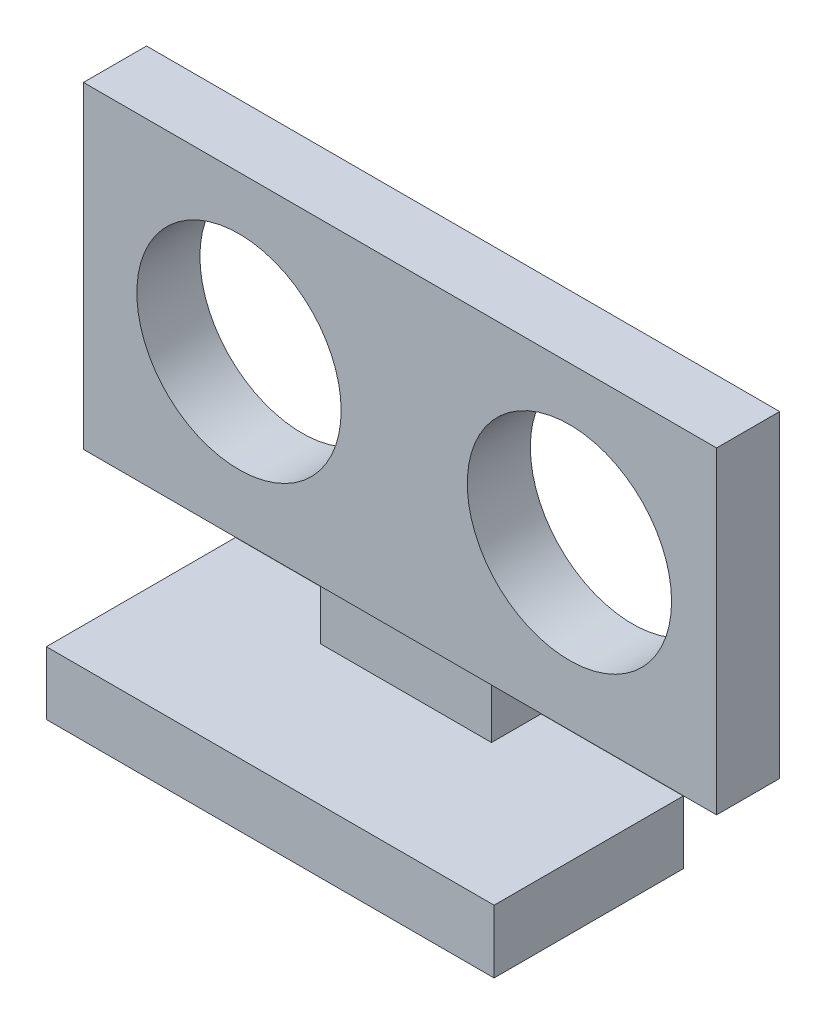
ISO-10303-21;
HEADER;
FILE_DESCRIPTION(('STEP AP214'),'2;1');
FILE_NAME('part.step','',(''),(''),'','','');
FILE_SCHEMA(('AUTOMOTIVE_DESIGN { 1 0 10303 214 1 1 1 1 }'));
ENDSEC;
DATA;
#1=APPLICATION_CONTEXT('core data for automotive mechanical design processes');
#2=APPLICATION_PROTOCOL_DEFINITION('international standard','automotive_design',2000,#1);
#3=PRODUCT_CONTEXT('',#1,'mechanical');
#4=PRODUCT('Part','Part','',(#3));
#5=PRODUCT_RELATED_PRODUCT_CATEGORY('part','',(#4));
#6=PRODUCT_DEFINITION_FORMATION('','',#4);
#7=PRODUCT_DEFINITION_CONTEXT('part definition',#1,'design');
#8=PRODUCT_DEFINITION('design','',#6,#7);
#9=PRODUCT_DEFINITION_SHAPE('','',#8);
#10=(LENGTH_UNIT() NAMED_UNIT(*) SI_UNIT(.MILLI.,.METRE.));
#11=(NAMED_UNIT(*) PLANE_ANGLE_UNIT() SI_UNIT($,.RADIAN.));
#12=(NAMED_UNIT(*) SI_UNIT($,.STERADIAN.) SOLID_ANGLE_UNIT());
#13=UNCERTAINTY_MEASURE_WITH_UNIT(LENGTH_MEASURE(1.E-05),#10,'distance_accuracy_value','');
#14=(GEOMETRIC_REPRESENTATION_CONTEXT(3) GLOBAL_UNCERTAINTY_ASSIGNED_CONTEXT((#13)) GLOBAL_UNIT_ASSIGNED_CONTEXT((#10,
#11,#12)) REPRESENTATION_CONTEXT('',''));
#15=CARTESIAN_POINT('',(0.,0.,0.));
#16=DIRECTION('',(0.,0.,1.));
#17=DIRECTION('',(1.,0.,0.));
#18=AXIS2_PLACEMENT_3D('',#15,#16,#17);
#19=CARTESIAN_POINT('',(14.504129859339,5.,0.));
#20=DIRECTION('',(1.,0.,0.));
#21=DIRECTION('',(0.,0.,-1.));
#22=AXIS2_PLACEMENT_3D('',#19,#20,#21);
#23=PLANE('',#22);
#24=DIRECTION('',(0.,0.,1.));
#25=VECTOR('',#24,1.);
#26=CARTESIAN_POINT('',(14.504129859339,0.,0.));
#27=LINE('',#26,#25);
#28=CARTESIAN_POINT('',(14.504129859339,0.,-21.2753882568971));
#29=VERTEX_POINT('',#28);
#30=CARTESIAN_POINT('',(14.504129859339,0.,-6.27538825689709));
#31=VERTEX_POINT('',#30);
#32=EDGE_CURVE('E231',#29,#31,#27,.T.);
#33=ORIENTED_EDGE('',*,*,#32,.T.);
#34=DIRECTION('',(0.,-1.,0.));
#35=VECTOR('',#34,1.);
#36=CARTESIAN_POINT('',(14.504129859339,5.,-6.27538825689709));
#37=LINE('',#36,#35);
#38=CARTESIAN_POINT('',(14.504129859339,5.,-6.27538825689709));
#39=VERTEX_POINT('',#38);
#40=EDGE_CURVE('E11',#39,#31,#37,.T.);
#41=ORIENTED_EDGE('',*,*,#40,.F.);
#42=DIRECTION('',(0.,0.,1.));
#43=VECTOR('',#42,1.);
#44=CARTESIAN_POINT('',(14.504129859339,5.,0.));
#45=LINE('',#44,#43);
#46=CARTESIAN_POINT('',(14.504129859339,5.,-21.2753882568971));
#47=VERTEX_POINT('',#46);
#48=EDGE_CURVE('E232',#47,#39,#45,.T.);
#49=ORIENTED_EDGE('',*,*,#48,.F.);
#50=DIRECTION('',(0.,-1.,0.));
#51=VECTOR('',#50,1.);
#52=CARTESIAN_POINT('',(14.504129859339,5.,-21.2753882568971));
#53=LINE('',#52,#51);
#54=EDGE_CURVE('E248',#47,#29,#53,.T.);
#55=ORIENTED_EDGE('',*,*,#54,.T.);
#56=EDGE_LOOP('',(#33,#41,#49,#55));
#57=FACE_BOUND('',#56,.T.);
#58=ADVANCED_FACE('F46',(#57),#23,.F.);
#59=CARTESIAN_POINT('',(0.,5.,-6.27538825689709));
#60=DIRECTION('',(0.,0.,-1.));
#61=DIRECTION('',(-1.,0.,0.));
#62=AXIS2_PLACEMENT_3D('',#59,#60,#61);
#63=PLANE('',#62);
#64=DIRECTION('',(1.,0.,0.));
#65=VECTOR('',#64,1.);
#66=CARTESIAN_POINT('',(0.,0.,-6.27538825689709));
#67=LINE('',#66,#65);
#68=CARTESIAN_POINT('',(50.004129859339,0.,-6.27538825689709));
#69=VERTEX_POINT('',#68);
#70=EDGE_CURVE('E252',#31,#69,#67,.T.);
#71=ORIENTED_EDGE('',*,*,#70,.T.);
#72=DIRECTION('',(0.,-1.,0.));
#73=VECTOR('',#72,1.);
#74=CARTESIAN_POINT('',(50.004129859339,5.,-6.27538825689709));
#75=LINE('',#74,#73);
#76=CARTESIAN_POINT('',(50.004129859339,5.,-6.27538825689709));
#77=VERTEX_POINT('',#76);
#78=EDGE_CURVE('E55',#77,#69,#75,.T.);
#79=ORIENTED_EDGE('',*,*,#78,.F.);
#80=DIRECTION('',(1.,0.,0.));
#81=VECTOR('',#80,1.);
#82=CARTESIAN_POINT('',(0.,5.,-6.27538825689709));
#83=LINE('',#82,#81);
#84=EDGE_CURVE('E236',#39,#77,#83,.T.);
#85=ORIENTED_EDGE('',*,*,#84,.F.);
#86=ORIENTED_EDGE('',*,*,#40,.T.);
#87=EDGE_LOOP('',(#71,#79,#85,#86));
#88=FACE_BOUND('',#87,.T.);
#89=ADVANCED_FACE('F305',(#88),#63,.F.);
#90=CARTESIAN_POINT('',(50.004129859339,5.,0.));
#91=DIRECTION('',(1.,0.,0.));
#92=DIRECTION('',(0.,0.,-1.));
#93=AXIS2_PLACEMENT_3D('',#90,#91,#92);
#94=PLANE('',#93);
#95=DIRECTION('',(0.,0.,1.));
#96=VECTOR('',#95,1.);
#97=CARTESIAN_POINT('',(50.004129859339,0.,0.));
#98=LINE('',#97,#96);
#99=CARTESIAN_POINT('',(50.004129859339,0.,-21.2753882568971));
#100=VERTEX_POINT('',#99);
#101=EDGE_CURVE('E256',#100,#69,#98,.T.);
#102=ORIENTED_EDGE('',*,*,#101,.F.);
#103=DIRECTION('',(0.,-1.,0.));
#104=VECTOR('',#103,1.);
#105=CARTESIAN_POINT('',(50.004129859339,5.,-21.2753882568971));
#106=LINE('',#105,#104);
#107=CARTESIAN_POINT('',(50.004129859339,5.,-21.2753882568971));
#108=VERTEX_POINT('',#107);
#109=EDGE_CURVE('E265',#108,#100,#106,.T.);
#110=ORIENTED_EDGE('',*,*,#109,.F.);
#111=DIRECTION('',(0.,0.,1.));
#112=VECTOR('',#111,1.);
#113=CARTESIAN_POINT('',(50.004129859339,5.,0.));
#114=LINE('',#113,#112);
#115=EDGE_CURVE('E240',#108,#77,#114,.T.);
#116=ORIENTED_EDGE('',*,*,#115,.T.);
#117=ORIENTED_EDGE('',*,*,#78,.T.);
#118=EDGE_LOOP('',(#102,#110,#116,#117));
#119=FACE_BOUND('',#118,.T.);
#120=ADVANCED_FACE('F310',(#119),#94,.T.);
#121=CARTESIAN_POINT('',(0.,5.,-21.2753882568971));
#122=DIRECTION('',(0.,0.,-1.));
#123=DIRECTION('',(-1.,0.,0.));
#124=AXIS2_PLACEMENT_3D('',#121,#122,#123);
#125=PLANE('',#124);
#126=DIRECTION('',(1.,0.,0.));
#127=VECTOR('',#126,1.);
#128=CARTESIAN_POINT('',(0.,0.,-21.2753882568971));
#129=LINE('',#128,#127);
#130=EDGE_CURVE('E237',#29,#100,#129,.T.);
#131=ORIENTED_EDGE('',*,*,#130,.F.);
#132=ORIENTED_EDGE('',*,*,#54,.F.);
#133=DIRECTION('',(1.,0.,0.));
#134=VECTOR('',#133,1.);
#135=CARTESIAN_POINT('',(0.,5.,-21.2753882568971));
#136=LINE('',#135,#134);
#137=CARTESIAN_POINT('',(25.1664974837204,5.,-21.2753882568971));
#138=VERTEX_POINT('',#137);
#139=EDGE_CURVE('E244',#47,#138,#136,.T.);
#140=ORIENTED_EDGE('',*,*,#139,.T.);
#141=DIRECTION('',(0.,-1.,0.));
#142=VECTOR('',#141,1.);
#143=CARTESIAN_POINT('',(25.1664974837204,10.,-21.2753882568971));
#144=LINE('',#143,#142);
#145=CARTESIAN_POINT('',(25.1664974837204,10.,-21.2753882568971));
#146=VERTEX_POINT('',#145);
#147=EDGE_CURVE('E209',#146,#138,#144,.T.);
#148=ORIENTED_EDGE('',*,*,#147,.F.);
#149=DIRECTION('',(-1.,0.,0.));
#150=VECTOR('',#149,1.);
#151=CARTESIAN_POINT('',(25.1664974837204,10.,-21.2753882568971));
#152=LINE('',#151,#150);
#153=CARTESIAN_POINT('',(38.7335825591619,10.,-21.2753882568971));
#154=VERTEX_POINT('',#153);
#155=EDGE_CURVE('E205',#154,#146,#152,.T.);
#156=ORIENTED_EDGE('',*,*,#155,.F.);
#157=DIRECTION('',(0.,-1.,0.));
#158=VECTOR('',#157,1.);
#159=CARTESIAN_POINT('',(38.7335825591619,10.,-21.2753882568971));
#160=LINE('',#159,#158);
#161=CARTESIAN_POINT('',(38.7335825591619,5.,-21.2753882568971));
#162=VERTEX_POINT('',#161);
#163=EDGE_CURVE('E220',#154,#162,#160,.T.);
#164=ORIENTED_EDGE('',*,*,#163,.T.);
#165=EDGE_CURVE('E69',#162,#108,#136,.T.);
#166=ORIENTED_EDGE('',*,*,#165,.T.);
#167=ORIENTED_EDGE('',*,*,#109,.T.);
#168=EDGE_LOOP('',(#131,#132,#140,#148,#156,#164,#166,#167));
#169=FACE_BOUND('',#168,.T.);
#170=ADVANCED_FACE('F319',(#169),#125,.T.);
#171=CARTESIAN_POINT('',(0.,5.,0.));
#172=DIRECTION('',(0.,1.,0.));
#173=DIRECTION('',(0.,0.,1.));
#174=AXIS2_PLACEMENT_3D('',#171,#172,#173);
#175=PLANE('',#174);
#176=DIRECTION('',(0.,0.,1.));
#177=VECTOR('',#176,1.);
#178=CARTESIAN_POINT('',(25.1664974837204,5.,-21.2753882568971));
#179=LINE('',#178,#177);
#180=CARTESIAN_POINT('',(25.1664974837204,5.,-17.3425959706985));
#181=VERTEX_POINT('',#180);
#182=EDGE_CURVE('E160',#138,#181,#179,.T.);
#183=ORIENTED_EDGE('',*,*,#182,.F.);
#184=ORIENTED_EDGE('',*,*,#139,.F.);
#185=ORIENTED_EDGE('',*,*,#48,.T.);
#186=ORIENTED_EDGE('',*,*,#84,.T.);
#187=ORIENTED_EDGE('',*,*,#115,.F.);
#188=ORIENTED_EDGE('',*,*,#165,.F.);
#189=DIRECTION('',(0.,0.,-1.));
#190=VECTOR('',#189,1.);
#191=CARTESIAN_POINT('',(38.7335825591619,5.,-21.2753882568971));
#192=LINE('',#191,#190);
#193=CARTESIAN_POINT('',(38.7335825591619,5.,-17.3425959706985));
#194=VERTEX_POINT('',#193);
#195=EDGE_CURVE('E197',#194,#162,#192,.T.);
#196=ORIENTED_EDGE('',*,*,#195,.F.);
#197=DIRECTION('',(1.,0.,0.));
#198=VECTOR('',#197,1.);
#199=CARTESIAN_POINT('',(25.1664974837204,5.,-17.3425959706985));
#200=LINE('',#199,#198);
#201=EDGE_CURVE('E63',#181,#194,#200,.T.);
#202=ORIENTED_EDGE('',*,*,#201,.F.);
#203=EDGE_LOOP('',(#183,#184,#185,#186,#187,#188,#196,#202));
#204=FACE_BOUND('',#203,.T.);
#205=ADVANCED_FACE('F325',(#204),#175,.T.);
#206=CARTESIAN_POINT('',(0.,0.,0.));
#207=DIRECTION('',(0.,1.,0.));
#208=DIRECTION('',(0.,0.,1.));
#209=AXIS2_PLACEMENT_3D('',#206,#207,#208);
#210=PLANE('',#209);
#211=ORIENTED_EDGE('',*,*,#32,.F.);
#212=ORIENTED_EDGE('',*,*,#130,.T.);
#213=ORIENTED_EDGE('',*,*,#101,.T.);
#214=ORIENTED_EDGE('',*,*,#70,.F.);
#215=EDGE_LOOP('',(#211,#212,#213,#214));
#216=FACE_BOUND('',#215,.T.);
#217=ADVANCED_FACE('F317',(#216),#210,.F.);
#218=CARTESIAN_POINT('',(25.1664974837204,10.,-21.2753882568971));
#219=DIRECTION('',(1.,0.,0.));
#220=DIRECTION('',(0.,0.,-1.));
#221=AXIS2_PLACEMENT_3D('',#218,#219,#220);
#222=PLANE('',#221);
#223=ORIENTED_EDGE('',*,*,#182,.T.);
#224=DIRECTION('',(0.,-1.,0.));
#225=VECTOR('',#224,1.);
#226=CARTESIAN_POINT('',(25.1664974837204,10.,-17.3425959706985));
#227=LINE('',#226,#225);
#228=CARTESIAN_POINT('',(25.1664974837204,10.,-17.3425959706985));
#229=VERTEX_POINT('',#228);
#230=EDGE_CURVE('E228',#229,#181,#227,.T.);
#231=ORIENTED_EDGE('',*,*,#230,.F.);
#232=DIRECTION('',(0.,0.,1.));
#233=VECTOR('',#232,1.);
#234=CARTESIAN_POINT('',(25.1664974837204,10.,-21.2753882568971));
#235=LINE('',#234,#233);
#236=EDGE_CURVE('E192',#146,#229,#235,.T.);
#237=ORIENTED_EDGE('',*,*,#236,.F.);
#238=ORIENTED_EDGE('',*,*,#147,.T.);
#239=EDGE_LOOP('',(#223,#231,#237,#238));
#240=FACE_BOUND('',#239,.T.);
#241=ADVANCED_FACE('F329',(#240),#222,.F.);
#242=CARTESIAN_POINT('',(25.1664974837204,10.,-17.3425959706985));
#243=DIRECTION('',(0.,0.,-1.));
#244=DIRECTION('',(-1.,0.,0.));
#245=AXIS2_PLACEMENT_3D('',#242,#243,#244);
#246=PLANE('',#245);
#247=ORIENTED_EDGE('',*,*,#201,.T.);
#248=DIRECTION('',(0.,-1.,0.));
#249=VECTOR('',#248,1.);
#250=CARTESIAN_POINT('',(38.7335825591619,10.,-17.3425959706985));
#251=LINE('',#250,#249);
#252=CARTESIAN_POINT('',(38.7335825591619,10.,-17.3425959706985));
#253=VERTEX_POINT('',#252);
#254=EDGE_CURVE('E224',#253,#194,#251,.T.);
#255=ORIENTED_EDGE('',*,*,#254,.F.);
#256=DIRECTION('',(1.,0.,0.));
#257=VECTOR('',#256,1.);
#258=CARTESIAN_POINT('',(25.1664974837204,10.,-17.3425959706985));
#259=LINE('',#258,#257);
#260=EDGE_CURVE('E196',#229,#253,#259,.T.);
#261=ORIENTED_EDGE('',*,*,#260,.F.);
#262=ORIENTED_EDGE('',*,*,#230,.T.);
#263=EDGE_LOOP('',(#247,#255,#261,#262));
#264=FACE_BOUND('',#263,.T.);
#265=ADVANCED_FACE('F301',(#264),#246,.F.);
#266=CARTESIAN_POINT('',(38.7335825591619,10.,-21.2753882568971));
#267=DIRECTION('',(-1.,0.,0.));
#268=DIRECTION('',(0.,0.,1.));
#269=AXIS2_PLACEMENT_3D('',#266,#267,#268);
#270=PLANE('',#269);
#271=ORIENTED_EDGE('',*,*,#195,.T.);
#272=ORIENTED_EDGE('',*,*,#163,.F.);
#273=DIRECTION('',(0.,0.,-1.));
#274=VECTOR('',#273,1.);
#275=CARTESIAN_POINT('',(38.7335825591619,10.,-21.2753882568971));
#276=LINE('',#275,#274);
#277=EDGE_CURVE('E201',#253,#154,#276,.T.);
#278=ORIENTED_EDGE('',*,*,#277,.F.);
#279=ORIENTED_EDGE('',*,*,#254,.T.);
#280=EDGE_LOOP('',(#271,#272,#278,#279));
#281=FACE_BOUND('',#280,.T.);
#282=ADVANCED_FACE('F290',(#281),#270,.F.);
#283=CARTESIAN_POINT('',(7.42685159690627,35.2,-16.2947715854473));
#284=DIRECTION('',(0.,0.,-1.));
#285=DIRECTION('',(-1.,0.,0.));
#286=AXIS2_PLACEMENT_3D('',#283,#284,#285);
#287=PLANE('',#286);
#288=CARTESIAN_POINT('',(19.7589001193031,22.8758763229992,-16.2947715854473));
#289=DIRECTION('',(0.,0.,1.));
#290=DIRECTION('',(1.,0.,0.));
#291=AXIS2_PLACEMENT_3D('',#288,#289,#290);
#292=CIRCLE('',#291,8.09999999999999);
#293=CARTESIAN_POINT('',(27.8589001193031,22.8758763229992,-16.2947715854473));
#294=VERTEX_POINT('',#293);
#295=EDGE_CURVE('E272',#294,#294,#292,.T.);
#296=ORIENTED_EDGE('',*,*,#295,.F.);
#297=EDGE_LOOP('',(#296));
#298=FACE_BOUND('',#297,.T.);
#299=CARTESIAN_POINT('',(45.9589001193031,22.8758763229992,-16.2947715854473));
#300=DIRECTION('',(0.,0.,1.));
#301=DIRECTION('',(1.,0.,0.));
#302=AXIS2_PLACEMENT_3D('',#299,#300,#301);
#303=CIRCLE('',#302,8.1);
#304=CARTESIAN_POINT('',(54.0589001193031,22.8758763229992,-16.2947715854473));
#305=VERTEX_POINT('',#304);
#306=EDGE_CURVE('E279',#305,#305,#303,.T.);
#307=ORIENTED_EDGE('',*,*,#306,.F.);
#308=EDGE_LOOP('',(#307));
#309=FACE_BOUND('',#308,.T.);
#310=DIRECTION('',(1.,0.,0.));
#311=VECTOR('',#310,1.);
#312=CARTESIAN_POINT('',(7.42685159690627,10.,-16.2947715854473));
#313=LINE('',#312,#311);
#314=CARTESIAN_POINT('',(7.42685159690627,10.,-16.2947715854473));
#315=VERTEX_POINT('',#314);
#316=CARTESIAN_POINT('',(57.6268515969063,10.,-16.2947715854473));
#317=VERTEX_POINT('',#316);
#318=EDGE_CURVE('E155',#315,#317,#313,.T.);
#319=ORIENTED_EDGE('',*,*,#318,.T.);
#320=DIRECTION('',(0.,-1.,0.));
#321=VECTOR('',#320,1.);
#322=CARTESIAN_POINT('',(57.6268515969063,35.2,-16.2947715854473));
#323=LINE('',#322,#321);
#324=CARTESIAN_POINT('',(57.6268515969063,35.2,-16.2947715854473));
#325=VERTEX_POINT('',#324);
#326=EDGE_CURVE('E152',#325,#317,#323,.T.);
#327=ORIENTED_EDGE('',*,*,#326,.F.);
#328=DIRECTION('',(1.,0.,0.));
#329=VECTOR('',#328,1.);
#330=CARTESIAN_POINT('',(7.42685159690627,35.2,-16.2947715854473));
#331=LINE('',#330,#329);
#332=CARTESIAN_POINT('',(7.42685159690627,35.2,-16.2947715854473));
#333=VERTEX_POINT('',#332);
#334=EDGE_CURVE('E136',#333,#325,#331,.T.);
#335=ORIENTED_EDGE('',*,*,#334,.F.);
#336=DIRECTION('',(0.,-1.,0.));
#337=VECTOR('',#336,1.);
#338=CARTESIAN_POINT('',(7.42685159690627,35.2,-16.2947715854473));
#339=LINE('',#338,#337);
#340=EDGE_CURVE('E173',#333,#315,#339,.T.);
#341=ORIENTED_EDGE('',*,*,#340,.T.);
#342=EDGE_LOOP('',(#319,#327,#335,#341));
#343=FACE_BOUND('',#342,.T.);
#344=ADVANCED_FACE('F153',(#298,#309,#343),#287,.F.);
#345=CARTESIAN_POINT('',(57.6268515969063,35.2,-21.2947715854473));
#346=DIRECTION('',(1.,0.,0.));
#347=DIRECTION('',(0.,0.,-1.));
#348=AXIS2_PLACEMENT_3D('',#345,#346,#347);
#349=PLANE('',#348);
#350=DIRECTION('',(0.,0.,1.));
#351=VECTOR('',#350,1.);
#352=CARTESIAN_POINT('',(57.6268515969063,10.,-21.2947715854473));
#353=LINE('',#352,#351);
#354=CARTESIAN_POINT('',(57.6268515969063,10.,-21.2947715854473));
#355=VERTEX_POINT('',#354);
#356=EDGE_CURVE('E176',#355,#317,#353,.T.);
#357=ORIENTED_EDGE('',*,*,#356,.F.);
#358=DIRECTION('',(0.,-1.,0.));
#359=VECTOR('',#358,1.);
#360=CARTESIAN_POINT('',(57.6268515969063,35.2,-21.2947715854473));
#361=LINE('',#360,#359);
#362=CARTESIAN_POINT('',(57.6268515969063,35.2,-21.2947715854473));
#363=VERTEX_POINT('',#362);
#364=EDGE_CURVE('E161',#363,#355,#361,.T.);
#365=ORIENTED_EDGE('',*,*,#364,.F.);
#366=DIRECTION('',(0.,0.,1.));
#367=VECTOR('',#366,1.);
#368=CARTESIAN_POINT('',(57.6268515969063,35.2,-21.2947715854473));
#369=LINE('',#368,#367);
#370=EDGE_CURVE('E141',#363,#325,#369,.T.);
#371=ORIENTED_EDGE('',*,*,#370,.T.);
#372=ORIENTED_EDGE('',*,*,#326,.T.);
#373=EDGE_LOOP('',(#357,#365,#371,#372));
#374=FACE_BOUND('',#373,.T.);
#375=ADVANCED_FACE('F163',(#374),#349,.T.);
#376=CARTESIAN_POINT('',(7.42685159690604,35.2,-21.2947715854473));
#377=DIRECTION('',(0.,0.,-1.));
#378=DIRECTION('',(-1.,0.,0.));
#379=AXIS2_PLACEMENT_3D('',#376,#377,#378);
#380=PLANE('',#379);
#381=CARTESIAN_POINT('',(19.7589001193031,22.8758763229992,-21.2947715854473));
#382=DIRECTION('',(0.,0.,-1.));
#383=DIRECTION('',(-1.,0.,0.));
#384=AXIS2_PLACEMENT_3D('',#381,#382,#383);
#385=CIRCLE('',#384,8.09999999999999);
#386=CARTESIAN_POINT('',(11.6589001193031,22.8758763229992,-21.2947715854473));
#387=VERTEX_POINT('',#386);
#388=EDGE_CURVE('E49',#387,#387,#385,.T.);
#389=ORIENTED_EDGE('',*,*,#388,.F.);
#390=EDGE_LOOP('',(#389));
#391=FACE_BOUND('',#390,.T.);
#392=CARTESIAN_POINT('',(45.9589001193031,22.8758763229992,-21.2947715854473));
#393=DIRECTION('',(0.,0.,-1.));
#394=DIRECTION('',(-1.,0.,0.));
#395=AXIS2_PLACEMENT_3D('',#392,#393,#394);
#396=CIRCLE('',#395,8.1);
#397=CARTESIAN_POINT('',(37.8589001193031,22.8758763229992,-21.2947715854473));
#398=VERTEX_POINT('',#397);
#399=EDGE_CURVE('E269',#398,#398,#396,.T.);
#400=ORIENTED_EDGE('',*,*,#399,.F.);
#401=EDGE_LOOP('',(#400));
#402=FACE_BOUND('',#401,.T.);
#403=DIRECTION('',(1.,0.,0.));
#404=VECTOR('',#403,1.);
#405=CARTESIAN_POINT('',(7.42685159690604,10.,-21.2947715854473));
#406=LINE('',#405,#404);
#407=CARTESIAN_POINT('',(7.42685159690604,10.,-21.2947715854473));
#408=VERTEX_POINT('',#407);
#409=EDGE_CURVE('E179',#408,#355,#406,.T.);
#410=ORIENTED_EDGE('',*,*,#409,.F.);
#411=DIRECTION('',(0.,-1.,0.));
#412=VECTOR('',#411,1.);
#413=CARTESIAN_POINT('',(7.42685159690604,35.2,-21.2947715854473));
#414=LINE('',#413,#412);
#415=CARTESIAN_POINT('',(7.42685159690604,35.2,-21.2947715854473));
#416=VERTEX_POINT('',#415);
#417=EDGE_CURVE('E187',#416,#408,#414,.T.);
#418=ORIENTED_EDGE('',*,*,#417,.F.);
#419=DIRECTION('',(1.,0.,0.));
#420=VECTOR('',#419,1.);
#421=CARTESIAN_POINT('',(7.42685159690604,35.2,-21.2947715854473));
#422=LINE('',#421,#420);
#423=EDGE_CURVE('E165',#416,#363,#422,.T.);
#424=ORIENTED_EDGE('',*,*,#423,.T.);
#425=ORIENTED_EDGE('',*,*,#364,.T.);
#426=EDGE_LOOP('',(#410,#418,#424,#425));
#427=FACE_BOUND('',#426,.T.);
#428=ADVANCED_FACE('F298',(#391,#402,#427),#380,.T.);
#429=CARTESIAN_POINT('',(7.42685159690604,35.2,-21.2947715854473));
#430=DIRECTION('',(1.,0.,0.));
#431=DIRECTION('',(0.,0.,-1.));
#432=AXIS2_PLACEMENT_3D('',#429,#430,#431);
#433=PLANE('',#432);
#434=DIRECTION('',(0.,0.,1.));
#435=VECTOR('',#434,1.);
#436=CARTESIAN_POINT('',(7.42685159690604,10.,-21.2947715854473));
#437=LINE('',#436,#435);
#438=EDGE_CURVE('E149',#408,#315,#437,.T.);
#439=ORIENTED_EDGE('',*,*,#438,.T.);
#440=ORIENTED_EDGE('',*,*,#340,.F.);
#441=DIRECTION('',(0.,0.,1.));
#442=VECTOR('',#441,1.);
#443=CARTESIAN_POINT('',(7.42685159690604,35.2,-21.2947715854473));
#444=LINE('',#443,#442);
#445=EDGE_CURVE('E144',#416,#333,#444,.T.);
#446=ORIENTED_EDGE('',*,*,#445,.F.);
#447=ORIENTED_EDGE('',*,*,#417,.T.);
#448=EDGE_LOOP('',(#439,#440,#446,#447));
#449=FACE_BOUND('',#448,.T.);
#450=ADVANCED_FACE('F406',(#449),#433,.F.);
#451=CARTESIAN_POINT('',(0.,35.2,0.));
#452=DIRECTION('',(0.,-1.,0.));
#453=DIRECTION('',(0.,0.,-1.));
#454=AXIS2_PLACEMENT_3D('',#451,#452,#453);
#455=PLANE('',#454);
#456=ORIENTED_EDGE('',*,*,#334,.T.);
#457=ORIENTED_EDGE('',*,*,#370,.F.);
#458=ORIENTED_EDGE('',*,*,#423,.F.);
#459=ORIENTED_EDGE('',*,*,#445,.T.);
#460=EDGE_LOOP('',(#456,#457,#458,#459));
#461=FACE_BOUND('',#460,.T.);
#462=ADVANCED_FACE('F138',(#461),#455,.F.);
#463=CARTESIAN_POINT('',(0.,10.,0.));
#464=DIRECTION('',(0.,-1.,0.));
#465=DIRECTION('',(0.,0.,-1.));
#466=AXIS2_PLACEMENT_3D('',#463,#464,#465);
#467=PLANE('',#466);
#468=ORIENTED_EDGE('',*,*,#155,.T.);
#469=ORIENTED_EDGE('',*,*,#236,.T.);
#470=ORIENTED_EDGE('',*,*,#260,.T.);
#471=ORIENTED_EDGE('',*,*,#277,.T.);
#472=EDGE_LOOP('',(#468,#469,#470,#471));
#473=FACE_BOUND('',#472,.T.);
#474=ORIENTED_EDGE('',*,*,#318,.F.);
#475=ORIENTED_EDGE('',*,*,#438,.F.);
#476=ORIENTED_EDGE('',*,*,#409,.T.);
#477=ORIENTED_EDGE('',*,*,#356,.T.);
#478=EDGE_LOOP('',(#474,#475,#476,#477));
#479=FACE_BOUND('',#478,.T.);
#480=ADVANCED_FACE('F332',(#473,#479),#467,.T.);
#481=CARTESIAN_POINT('',(45.9589001193031,22.8758763229992,-26.2947715854473));
#482=DIRECTION('',(0.,0.,1.));
#483=DIRECTION('',(1.,0.,0.));
#484=AXIS2_PLACEMENT_3D('',#481,#482,#483);
#485=CYLINDRICAL_SURFACE('',#484,8.1);
#486=ORIENTED_EDGE('',*,*,#399,.T.);
#487=EDGE_LOOP('',(#486));
#488=FACE_BOUND('',#487,.T.);
#489=ORIENTED_EDGE('',*,*,#306,.T.);
#490=EDGE_LOOP('',(#489));
#491=FACE_BOUND('',#490,.T.);
#492=ADVANCED_FACE('F287',(#488,#491),#485,.F.);
#493=CARTESIAN_POINT('',(19.7589001193031,22.8758763229992,-26.2947715854473));
#494=DIRECTION('',(0.,0.,1.));
#495=DIRECTION('',(1.,0.,0.));
#496=AXIS2_PLACEMENT_3D('',#493,#494,#495);
#497=CYLINDRICAL_SURFACE('',#496,8.09999999999999);
#498=ORIENTED_EDGE('',*,*,#388,.T.);
#499=EDGE_LOOP('',(#498));
#500=FACE_BOUND('',#499,.T.);
#501=ORIENTED_EDGE('',*,*,#295,.T.);
#502=EDGE_LOOP('',(#501));
#503=FACE_BOUND('',#502,.T.);
#504=ADVANCED_FACE('F439',(#500,#503),#497,.F.);
#505=CLOSED_SHELL('',(#58,#89,#120,#170,#205,#217,#241,#265,#282,#344,#375,#428,#450,#462,#480,
#492,#504));
#506=MANIFOLD_SOLID_BREP('B2',#505);
#507=ADVANCED_BREP_SHAPE_REPRESENTATION('',(#18,#506),#14);
#508=SHAPE_DEFINITION_REPRESENTATION(#9,#507);
ENDSEC;
END-ISO-10303-21;
